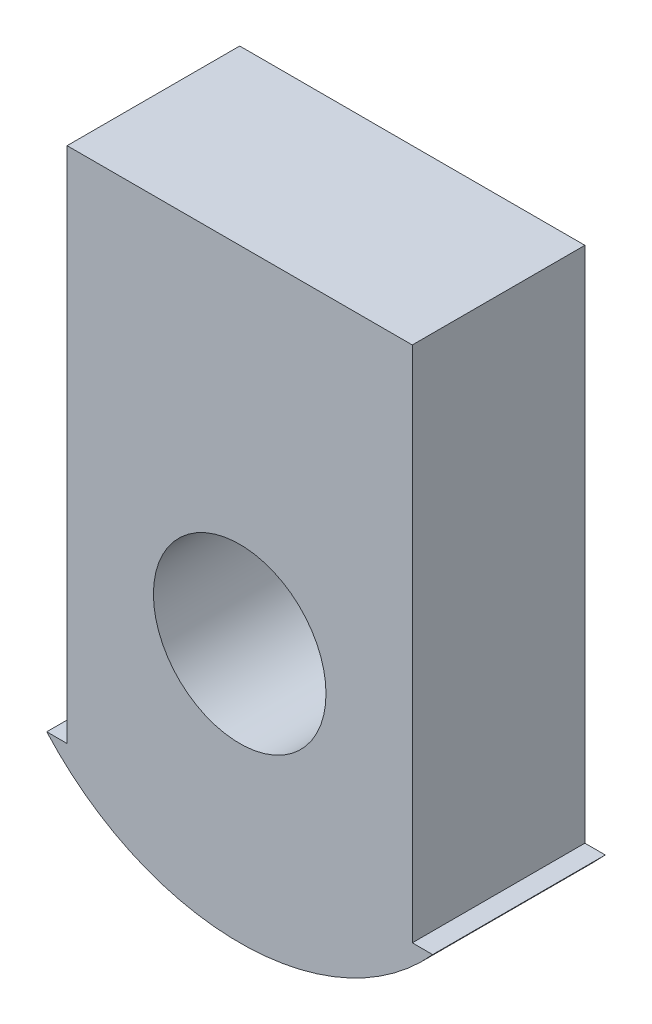
ISO-10303-21;
HEADER;
FILE_DESCRIPTION(('STEP AP214'),'2;1');
FILE_NAME('part.step','',(''),(''),'','','');
FILE_SCHEMA(('AUTOMOTIVE_DESIGN { 1 0 10303 214 1 1 1 1 }'));
ENDSEC;
DATA;
#1=APPLICATION_CONTEXT('core data for automotive mechanical design processes');
#2=APPLICATION_PROTOCOL_DEFINITION('international standard','automotive_design',2000,#1);
#3=PRODUCT_CONTEXT('',#1,'mechanical');
#4=PRODUCT('Part','Part','',(#3));
#5=PRODUCT_RELATED_PRODUCT_CATEGORY('part','',(#4));
#6=PRODUCT_DEFINITION_FORMATION('','',#4);
#7=PRODUCT_DEFINITION_CONTEXT('part definition',#1,'design');
#8=PRODUCT_DEFINITION('design','',#6,#7);
#9=PRODUCT_DEFINITION_SHAPE('','',#8);
#10=(LENGTH_UNIT() NAMED_UNIT(*) SI_UNIT(.MILLI.,.METRE.));
#11=(NAMED_UNIT(*) PLANE_ANGLE_UNIT() SI_UNIT($,.RADIAN.));
#12=(NAMED_UNIT(*) SI_UNIT($,.STERADIAN.) SOLID_ANGLE_UNIT());
#13=UNCERTAINTY_MEASURE_WITH_UNIT(LENGTH_MEASURE(1.E-05),#10,'distance_accuracy_value','');
#14=(GEOMETRIC_REPRESENTATION_CONTEXT(3) GLOBAL_UNCERTAINTY_ASSIGNED_CONTEXT((#13)) GLOBAL_UNIT_ASSIGNED_CONTEXT((#10,
#11,#12)) REPRESENTATION_CONTEXT('',''));
#15=CARTESIAN_POINT('',(0.,0.,0.));
#16=DIRECTION('',(0.,0.,1.));
#17=DIRECTION('',(1.,0.,0.));
#18=AXIS2_PLACEMENT_3D('',#15,#16,#17);
#19=CARTESIAN_POINT('',(0.,0.,5.));
#20=DIRECTION('',(0.,0.,1.));
#21=DIRECTION('',(1.,0.,0.));
#22=AXIS2_PLACEMENT_3D('',#19,#20,#21);
#23=PLANE('',#22);
#24=DIRECTION('',(0.,1.,0.));
#25=VECTOR('',#24,1.);
#26=CARTESIAN_POINT('',(5.,5.,5.));
#27=LINE('',#26,#25);
#28=CARTESIAN_POINT('',(5.,-5.,5.));
#29=VERTEX_POINT('',#28);
#30=CARTESIAN_POINT('',(5.,10.,5.));
#31=VERTEX_POINT('',#30);
#32=EDGE_CURVE('E48',#29,#31,#27,.T.);
#33=ORIENTED_EDGE('',*,*,#32,.T.);
#34=DIRECTION('',(-1.,0.,0.));
#35=VECTOR('',#34,1.);
#36=CARTESIAN_POINT('',(-5.,10.,5.));
#37=LINE('',#36,#35);
#38=CARTESIAN_POINT('',(-5.,10.,5.));
#39=VERTEX_POINT('',#38);
#40=EDGE_CURVE('E86',#31,#39,#37,.T.);
#41=ORIENTED_EDGE('',*,*,#40,.T.);
#42=DIRECTION('',(0.,-1.,0.));
#43=VECTOR('',#42,1.);
#44=CARTESIAN_POINT('',(-5.,5.,5.));
#45=LINE('',#44,#43);
#46=CARTESIAN_POINT('',(-5.,-5.,5.));
#47=VERTEX_POINT('',#46);
#48=EDGE_CURVE('E100',#39,#47,#45,.T.);
#49=ORIENTED_EDGE('',*,*,#48,.T.);
#50=DIRECTION('',(-1.,0.,0.));
#51=VECTOR('',#50,1.);
#52=CARTESIAN_POINT('',(-5.59016994374947,-5.,5.));
#53=LINE('',#52,#51);
#54=CARTESIAN_POINT('',(-5.59016994374947,-5.,5.));
#55=VERTEX_POINT('',#54);
#56=EDGE_CURVE('E94',#47,#55,#53,.T.);
#57=ORIENTED_EDGE('',*,*,#56,.T.);
#58=CARTESIAN_POINT('',(0.,0.,5.));
#59=DIRECTION('',(0.,0.,1.));
#60=DIRECTION('',(1.,0.,0.));
#61=AXIS2_PLACEMENT_3D('',#58,#59,#60);
#62=CIRCLE('',#61,7.5);
#63=CARTESIAN_POINT('',(5.59016994374947,-5.,5.));
#64=VERTEX_POINT('',#63);
#65=EDGE_CURVE('E98',#55,#64,#62,.T.);
#66=ORIENTED_EDGE('',*,*,#65,.T.);
#67=DIRECTION('',(-1.,0.,0.));
#68=VECTOR('',#67,1.);
#69=CARTESIAN_POINT('',(5.,-5.,5.));
#70=LINE('',#69,#68);
#71=EDGE_CURVE('E114',#64,#29,#70,.T.);
#72=ORIENTED_EDGE('',*,*,#71,.T.);
#73=EDGE_LOOP('',(#33,#41,#49,#57,#66,#72));
#74=FACE_BOUND('',#73,.T.);
#75=CARTESIAN_POINT('',(0.,0.,5.));
#76=DIRECTION('',(0.,0.,1.));
#77=DIRECTION('',(1.,0.,0.));
#78=AXIS2_PLACEMENT_3D('',#75,#76,#77);
#79=CIRCLE('',#78,2.5);
#80=CARTESIAN_POINT('',(2.5,0.,5.));
#81=VERTEX_POINT('',#80);
#82=EDGE_CURVE('E124',#81,#81,#79,.T.);
#83=ORIENTED_EDGE('',*,*,#82,.F.);
#84=EDGE_LOOP('',(#83));
#85=FACE_BOUND('',#84,.T.);
#86=ADVANCED_FACE('F31',(#74,#85),#23,.T.);
#87=CARTESIAN_POINT('',(0.,0.,0.));
#88=DIRECTION('',(0.,0.,1.));
#89=DIRECTION('',(1.,0.,0.));
#90=AXIS2_PLACEMENT_3D('',#87,#88,#89);
#91=PLANE('',#90);
#92=DIRECTION('',(-1.,0.,0.));
#93=VECTOR('',#92,1.);
#94=CARTESIAN_POINT('',(-5.,10.,0.));
#95=LINE('',#94,#93);
#96=CARTESIAN_POINT('',(5.,10.,0.));
#97=VERTEX_POINT('',#96);
#98=CARTESIAN_POINT('',(-5.,10.,0.));
#99=VERTEX_POINT('',#98);
#100=EDGE_CURVE('E120',#97,#99,#95,.T.);
#101=ORIENTED_EDGE('',*,*,#100,.F.);
#102=DIRECTION('',(0.,1.,0.));
#103=VECTOR('',#102,1.);
#104=CARTESIAN_POINT('',(5.,-5.,0.));
#105=LINE('',#104,#103);
#106=CARTESIAN_POINT('',(5.,-5.,0.));
#107=VERTEX_POINT('',#106);
#108=EDGE_CURVE('E129',#107,#97,#105,.T.);
#109=ORIENTED_EDGE('',*,*,#108,.F.);
#110=DIRECTION('',(-1.,0.,0.));
#111=VECTOR('',#110,1.);
#112=CARTESIAN_POINT('',(5.,-5.,0.));
#113=LINE('',#112,#111);
#114=CARTESIAN_POINT('',(5.59016994374947,-5.,0.));
#115=VERTEX_POINT('',#114);
#116=EDGE_CURVE('E79',#115,#107,#113,.T.);
#117=ORIENTED_EDGE('',*,*,#116,.F.);
#118=CARTESIAN_POINT('',(0.,0.,0.));
#119=DIRECTION('',(0.,0.,1.));
#120=DIRECTION('',(1.,0.,0.));
#121=AXIS2_PLACEMENT_3D('',#118,#119,#120);
#122=CIRCLE('',#121,7.5);
#123=CARTESIAN_POINT('',(-5.59016994374947,-5.,0.));
#124=VERTEX_POINT('',#123);
#125=EDGE_CURVE('E72',#124,#115,#122,.T.);
#126=ORIENTED_EDGE('',*,*,#125,.F.);
#127=DIRECTION('',(-1.,0.,0.));
#128=VECTOR('',#127,1.);
#129=CARTESIAN_POINT('',(-5.59016994374947,-5.,0.));
#130=LINE('',#129,#128);
#131=CARTESIAN_POINT('',(-5.,-5.,0.));
#132=VERTEX_POINT('',#131);
#133=EDGE_CURVE('E108',#132,#124,#130,.T.);
#134=ORIENTED_EDGE('',*,*,#133,.F.);
#135=DIRECTION('',(0.,-1.,0.));
#136=VECTOR('',#135,1.);
#137=CARTESIAN_POINT('',(-5.,-5.,0.));
#138=LINE('',#137,#136);
#139=EDGE_CURVE('E123',#99,#132,#138,.T.);
#140=ORIENTED_EDGE('',*,*,#139,.F.);
#141=EDGE_LOOP('',(#101,#109,#117,#126,#134,#140));
#142=FACE_BOUND('',#141,.T.);
#143=CARTESIAN_POINT('',(0.,0.,0.));
#144=DIRECTION('',(0.,0.,1.));
#145=DIRECTION('',(1.,0.,0.));
#146=AXIS2_PLACEMENT_3D('',#143,#144,#145);
#147=CIRCLE('',#146,2.5);
#148=CARTESIAN_POINT('',(2.5,0.,0.));
#149=VERTEX_POINT('',#148);
#150=EDGE_CURVE('E146',#149,#149,#147,.T.);
#151=ORIENTED_EDGE('',*,*,#150,.T.);
#152=EDGE_LOOP('',(#151));
#153=FACE_BOUND('',#152,.T.);
#154=ADVANCED_FACE('F139',(#142,#153),#91,.F.);
#155=CARTESIAN_POINT('',(-5.,10.,5.));
#156=DIRECTION('',(0.,-1.,0.));
#157=DIRECTION('',(0.,0.,-1.));
#158=AXIS2_PLACEMENT_3D('',#155,#156,#157);
#159=PLANE('',#158);
#160=ORIENTED_EDGE('',*,*,#100,.T.);
#161=DIRECTION('',(0.,0.,-1.));
#162=VECTOR('',#161,1.);
#163=CARTESIAN_POINT('',(-5.,10.,5.));
#164=LINE('',#163,#162);
#165=EDGE_CURVE('E40',#39,#99,#164,.T.);
#166=ORIENTED_EDGE('',*,*,#165,.F.);
#167=ORIENTED_EDGE('',*,*,#40,.F.);
#168=DIRECTION('',(0.,0.,-1.));
#169=VECTOR('',#168,1.);
#170=CARTESIAN_POINT('',(5.,10.,5.));
#171=LINE('',#170,#169);
#172=EDGE_CURVE('E11',#31,#97,#171,.T.);
#173=ORIENTED_EDGE('',*,*,#172,.T.);
#174=EDGE_LOOP('',(#160,#166,#167,#173));
#175=FACE_BOUND('',#174,.T.);
#176=ADVANCED_FACE('F33',(#175),#159,.F.);
#177=CARTESIAN_POINT('',(-5.,-5.,5.));
#178=DIRECTION('',(1.,0.,0.));
#179=DIRECTION('',(0.,0.,-1.));
#180=AXIS2_PLACEMENT_3D('',#177,#178,#179);
#181=PLANE('',#180);
#182=ORIENTED_EDGE('',*,*,#139,.T.);
#183=DIRECTION('',(0.,0.,-1.));
#184=VECTOR('',#183,1.);
#185=CARTESIAN_POINT('',(-5.,-5.,5.));
#186=LINE('',#185,#184);
#187=EDGE_CURVE('E109',#47,#132,#186,.T.);
#188=ORIENTED_EDGE('',*,*,#187,.F.);
#189=ORIENTED_EDGE('',*,*,#48,.F.);
#190=ORIENTED_EDGE('',*,*,#165,.T.);
#191=EDGE_LOOP('',(#182,#188,#189,#190));
#192=FACE_BOUND('',#191,.T.);
#193=ADVANCED_FACE('F135',(#192),#181,.F.);
#194=CARTESIAN_POINT('',(-5.59016994374947,-5.,5.));
#195=DIRECTION('',(0.,-1.,0.));
#196=DIRECTION('',(1.,0.,0.));
#197=AXIS2_PLACEMENT_3D('',#194,#195,#196);
#198=PLANE('',#197);
#199=ORIENTED_EDGE('',*,*,#133,.T.);
#200=DIRECTION('',(0.,0.,-1.));
#201=VECTOR('',#200,1.);
#202=CARTESIAN_POINT('',(-5.59016994374947,-5.,5.));
#203=LINE('',#202,#201);
#204=EDGE_CURVE('E105',#55,#124,#203,.T.);
#205=ORIENTED_EDGE('',*,*,#204,.F.);
#206=ORIENTED_EDGE('',*,*,#56,.F.);
#207=ORIENTED_EDGE('',*,*,#187,.T.);
#208=EDGE_LOOP('',(#199,#205,#206,#207));
#209=FACE_BOUND('',#208,.T.);
#210=ADVANCED_FACE('F106',(#209),#198,.F.);
#211=CARTESIAN_POINT('',(0.,0.,5.));
#212=DIRECTION('',(0.,0.,-1.));
#213=DIRECTION('',(-1.,0.,0.));
#214=AXIS2_PLACEMENT_3D('',#211,#212,#213);
#215=CYLINDRICAL_SURFACE('',#214,7.5);
#216=ORIENTED_EDGE('',*,*,#125,.T.);
#217=DIRECTION('',(0.,0.,-1.));
#218=VECTOR('',#217,1.);
#219=CARTESIAN_POINT('',(5.59016994374947,-5.,5.));
#220=LINE('',#219,#218);
#221=EDGE_CURVE('E110',#64,#115,#220,.T.);
#222=ORIENTED_EDGE('',*,*,#221,.F.);
#223=ORIENTED_EDGE('',*,*,#65,.F.);
#224=ORIENTED_EDGE('',*,*,#204,.T.);
#225=EDGE_LOOP('',(#216,#222,#223,#224));
#226=FACE_BOUND('',#225,.T.);
#227=ADVANCED_FACE('F112',(#226),#215,.T.);
#228=CARTESIAN_POINT('',(5.,-5.,5.));
#229=DIRECTION('',(0.,-1.,0.));
#230=DIRECTION('',(1.,0.,0.));
#231=AXIS2_PLACEMENT_3D('',#228,#229,#230);
#232=PLANE('',#231);
#233=ORIENTED_EDGE('',*,*,#116,.T.);
#234=DIRECTION('',(0.,0.,-1.));
#235=VECTOR('',#234,1.);
#236=CARTESIAN_POINT('',(5.,-5.,5.));
#237=LINE('',#236,#235);
#238=EDGE_CURVE('E116',#29,#107,#237,.T.);
#239=ORIENTED_EDGE('',*,*,#238,.F.);
#240=ORIENTED_EDGE('',*,*,#71,.F.);
#241=ORIENTED_EDGE('',*,*,#221,.T.);
#242=EDGE_LOOP('',(#233,#239,#240,#241));
#243=FACE_BOUND('',#242,.T.);
#244=ADVANCED_FACE('F142',(#243),#232,.F.);
#245=CARTESIAN_POINT('',(5.,-5.,5.));
#246=DIRECTION('',(-1.,0.,0.));
#247=DIRECTION('',(0.,0.,1.));
#248=AXIS2_PLACEMENT_3D('',#245,#246,#247);
#249=PLANE('',#248);
#250=ORIENTED_EDGE('',*,*,#108,.T.);
#251=ORIENTED_EDGE('',*,*,#172,.F.);
#252=ORIENTED_EDGE('',*,*,#32,.F.);
#253=ORIENTED_EDGE('',*,*,#238,.T.);
#254=EDGE_LOOP('',(#250,#251,#252,#253));
#255=FACE_BOUND('',#254,.T.);
#256=ADVANCED_FACE('F141',(#255),#249,.F.);
#257=CARTESIAN_POINT('',(0.,0.,5.));
#258=DIRECTION('',(0.,0.,-1.));
#259=DIRECTION('',(-1.,0.,0.));
#260=AXIS2_PLACEMENT_3D('',#257,#258,#259);
#261=CYLINDRICAL_SURFACE('',#260,2.5);
#262=ORIENTED_EDGE('',*,*,#82,.T.);
#263=EDGE_LOOP('',(#262));
#264=FACE_BOUND('',#263,.T.);
#265=ORIENTED_EDGE('',*,*,#150,.F.);
#266=EDGE_LOOP('',(#265));
#267=FACE_BOUND('',#266,.T.);
#268=ADVANCED_FACE('F152',(#264,#267),#261,.F.);
#269=CLOSED_SHELL('',(#86,#154,#176,#193,#210,#227,#244,#256,#268));
#270=MANIFOLD_SOLID_BREP('B2',#269);
#271=ADVANCED_BREP_SHAPE_REPRESENTATION('',(#18,#270),#14);
#272=SHAPE_DEFINITION_REPRESENTATION(#9,#271);
ENDSEC;
END-ISO-10303-21;
